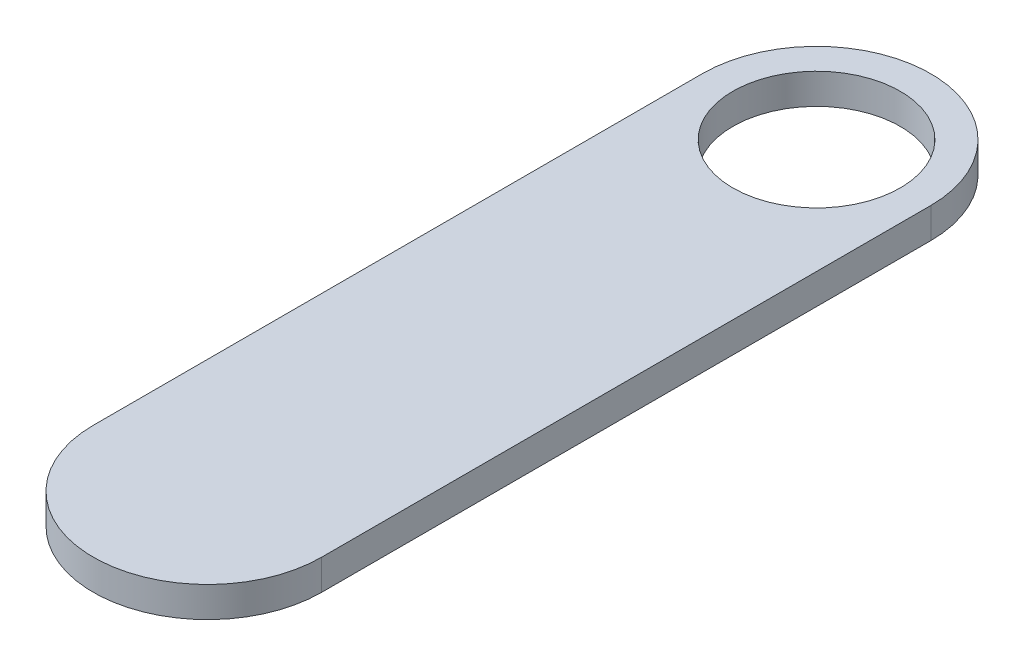
ISO-10303-21;
HEADER;
FILE_DESCRIPTION(('STEP AP214'),'2;1');
FILE_NAME('part.step','',(''),(''),'','','');
FILE_SCHEMA(('AUTOMOTIVE_DESIGN { 1 0 10303 214 1 1 1 1 }'));
ENDSEC;
DATA;
#1=APPLICATION_CONTEXT('core data for automotive mechanical design processes');
#2=APPLICATION_PROTOCOL_DEFINITION('international standard','automotive_design',2000,#1);
#3=PRODUCT_CONTEXT('',#1,'mechanical');
#4=PRODUCT('Part','Part','',(#3));
#5=PRODUCT_RELATED_PRODUCT_CATEGORY('part','',(#4));
#6=PRODUCT_DEFINITION_FORMATION('','',#4);
#7=PRODUCT_DEFINITION_CONTEXT('part definition',#1,'design');
#8=PRODUCT_DEFINITION('design','',#6,#7);
#9=PRODUCT_DEFINITION_SHAPE('','',#8);
#10=(LENGTH_UNIT() NAMED_UNIT(*) SI_UNIT(.MILLI.,.METRE.));
#11=(NAMED_UNIT(*) PLANE_ANGLE_UNIT() SI_UNIT($,.RADIAN.));
#12=(NAMED_UNIT(*) SI_UNIT($,.STERADIAN.) SOLID_ANGLE_UNIT());
#13=UNCERTAINTY_MEASURE_WITH_UNIT(LENGTH_MEASURE(1.E-05),#10,'distance_accuracy_value','');
#14=(GEOMETRIC_REPRESENTATION_CONTEXT(3) GLOBAL_UNCERTAINTY_ASSIGNED_CONTEXT((#13)) GLOBAL_UNIT_ASSIGNED_CONTEXT((#10,
#11,#12)) REPRESENTATION_CONTEXT('',''));
#15=CARTESIAN_POINT('',(0.,0.,0.));
#16=DIRECTION('',(0.,0.,1.));
#17=DIRECTION('',(1.,0.,0.));
#18=AXIS2_PLACEMENT_3D('',#15,#16,#17);
#19=CARTESIAN_POINT('',(0.,2.,0.));
#20=DIRECTION('',(0.,1.,0.));
#21=DIRECTION('',(0.,0.,1.));
#22=AXIS2_PLACEMENT_3D('',#19,#20,#21);
#23=PLANE('',#22);
#24=CARTESIAN_POINT('',(0.,2.,0.));
#25=DIRECTION('',(0.,1.,0.));
#26=DIRECTION('',(0.,0.,1.));
#27=AXIS2_PLACEMENT_3D('',#24,#25,#26);
#28=CIRCLE('',#27,7.5);
#29=CARTESIAN_POINT('',(-7.5,2.,0.));
#30=VERTEX_POINT('',#29);
#31=CARTESIAN_POINT('',(7.5,2.,0.));
#32=VERTEX_POINT('',#31);
#33=EDGE_CURVE('E91',#30,#32,#28,.T.);
#34=ORIENTED_EDGE('',*,*,#33,.T.);
#35=DIRECTION('',(0.,0.,-1.));
#36=VECTOR('',#35,1.);
#37=CARTESIAN_POINT('',(7.5,2.,0.));
#38=LINE('',#37,#36);
#39=CARTESIAN_POINT('',(7.5,2.,-40.));
#40=VERTEX_POINT('',#39);
#41=EDGE_CURVE('E86',#32,#40,#38,.T.);
#42=ORIENTED_EDGE('',*,*,#41,.T.);
#43=CARTESIAN_POINT('',(0.,2.,-40.));
#44=DIRECTION('',(0.,1.,0.));
#45=DIRECTION('',(0.,0.,1.));
#46=AXIS2_PLACEMENT_3D('',#43,#44,#45);
#47=CIRCLE('',#46,7.5);
#48=CARTESIAN_POINT('',(-7.5,2.,-40.));
#49=VERTEX_POINT('',#48);
#50=EDGE_CURVE('E89',#40,#49,#47,.T.);
#51=ORIENTED_EDGE('',*,*,#50,.T.);
#52=DIRECTION('',(0.,0.,1.));
#53=VECTOR('',#52,1.);
#54=CARTESIAN_POINT('',(-7.5,2.,0.));
#55=LINE('',#54,#53);
#56=EDGE_CURVE('E56',#49,#30,#55,.T.);
#57=ORIENTED_EDGE('',*,*,#56,.T.);
#58=EDGE_LOOP('',(#34,#42,#51,#57));
#59=FACE_BOUND('',#58,.T.);
#60=CARTESIAN_POINT('',(0.,2.,-40.));
#61=DIRECTION('',(0.,1.,0.));
#62=DIRECTION('',(0.,0.,1.));
#63=AXIS2_PLACEMENT_3D('',#60,#61,#62);
#64=CIRCLE('',#63,5.5);
#65=CARTESIAN_POINT('',(0.,2.,-34.5));
#66=VERTEX_POINT('',#65);
#67=EDGE_CURVE('E106',#66,#66,#64,.T.);
#68=ORIENTED_EDGE('',*,*,#67,.F.);
#69=EDGE_LOOP('',(#68));
#70=FACE_BOUND('',#69,.T.);
#71=ADVANCED_FACE('F39',(#59,#70),#23,.T.);
#72=CARTESIAN_POINT('',(0.,0.,0.));
#73=DIRECTION('',(0.,1.,0.));
#74=DIRECTION('',(0.,0.,1.));
#75=AXIS2_PLACEMENT_3D('',#72,#73,#74);
#76=PLANE('',#75);
#77=CARTESIAN_POINT('',(0.,0.,0.));
#78=DIRECTION('',(0.,1.,0.));
#79=DIRECTION('',(0.,0.,1.));
#80=AXIS2_PLACEMENT_3D('',#77,#78,#79);
#81=CIRCLE('',#80,7.5);
#82=CARTESIAN_POINT('',(-7.5,0.,0.));
#83=VERTEX_POINT('',#82);
#84=CARTESIAN_POINT('',(7.5,0.,0.));
#85=VERTEX_POINT('',#84);
#86=EDGE_CURVE('E103',#83,#85,#81,.T.);
#87=ORIENTED_EDGE('',*,*,#86,.F.);
#88=DIRECTION('',(0.,0.,1.));
#89=VECTOR('',#88,1.);
#90=CARTESIAN_POINT('',(-7.5,0.,0.));
#91=LINE('',#90,#89);
#92=CARTESIAN_POINT('',(-7.5,0.,-40.));
#93=VERTEX_POINT('',#92);
#94=EDGE_CURVE('E79',#93,#83,#91,.T.);
#95=ORIENTED_EDGE('',*,*,#94,.F.);
#96=CARTESIAN_POINT('',(0.,0.,-40.));
#97=DIRECTION('',(0.,1.,0.));
#98=DIRECTION('',(0.,0.,1.));
#99=AXIS2_PLACEMENT_3D('',#96,#97,#98);
#100=CIRCLE('',#99,7.5);
#101=CARTESIAN_POINT('',(7.5,0.,-40.));
#102=VERTEX_POINT('',#101);
#103=EDGE_CURVE('E73',#102,#93,#100,.T.);
#104=ORIENTED_EDGE('',*,*,#103,.F.);
#105=DIRECTION('',(0.,0.,-1.));
#106=VECTOR('',#105,1.);
#107=CARTESIAN_POINT('',(7.5,0.,0.));
#108=LINE('',#107,#106);
#109=EDGE_CURVE('E95',#85,#102,#108,.T.);
#110=ORIENTED_EDGE('',*,*,#109,.F.);
#111=EDGE_LOOP('',(#87,#95,#104,#110));
#112=FACE_BOUND('',#111,.T.);
#113=CARTESIAN_POINT('',(0.,0.,-40.));
#114=DIRECTION('',(0.,1.,0.));
#115=DIRECTION('',(0.,0.,1.));
#116=AXIS2_PLACEMENT_3D('',#113,#114,#115);
#117=CIRCLE('',#116,5.5);
#118=CARTESIAN_POINT('',(0.,0.,-34.5));
#119=VERTEX_POINT('',#118);
#120=EDGE_CURVE('E118',#119,#119,#117,.T.);
#121=ORIENTED_EDGE('',*,*,#120,.T.);
#122=EDGE_LOOP('',(#121));
#123=FACE_BOUND('',#122,.T.);
#124=ADVANCED_FACE('F114',(#112,#123),#76,.F.);
#125=CARTESIAN_POINT('',(0.,2.,0.));
#126=DIRECTION('',(0.,-1.,0.));
#127=DIRECTION('',(0.,0.,-1.));
#128=AXIS2_PLACEMENT_3D('',#125,#126,#127);
#129=CYLINDRICAL_SURFACE('',#128,7.5);
#130=ORIENTED_EDGE('',*,*,#86,.T.);
#131=DIRECTION('',(0.,-1.,0.));
#132=VECTOR('',#131,1.);
#133=CARTESIAN_POINT('',(7.5,2.,0.));
#134=LINE('',#133,#132);
#135=EDGE_CURVE('E11',#32,#85,#134,.T.);
#136=ORIENTED_EDGE('',*,*,#135,.F.);
#137=ORIENTED_EDGE('',*,*,#33,.F.);
#138=DIRECTION('',(0.,-1.,0.));
#139=VECTOR('',#138,1.);
#140=CARTESIAN_POINT('',(-7.5,2.,0.));
#141=LINE('',#140,#139);
#142=EDGE_CURVE('E99',#30,#83,#141,.T.);
#143=ORIENTED_EDGE('',*,*,#142,.T.);
#144=EDGE_LOOP('',(#130,#136,#137,#143));
#145=FACE_BOUND('',#144,.T.);
#146=ADVANCED_FACE('F41',(#145),#129,.T.);
#147=CARTESIAN_POINT('',(7.5,2.,0.));
#148=DIRECTION('',(-1.,0.,0.));
#149=DIRECTION('',(0.,0.,1.));
#150=AXIS2_PLACEMENT_3D('',#147,#148,#149);
#151=PLANE('',#150);
#152=ORIENTED_EDGE('',*,*,#109,.T.);
#153=DIRECTION('',(0.,-1.,0.));
#154=VECTOR('',#153,1.);
#155=CARTESIAN_POINT('',(7.5,2.,-40.));
#156=LINE('',#155,#154);
#157=EDGE_CURVE('E48',#40,#102,#156,.T.);
#158=ORIENTED_EDGE('',*,*,#157,.F.);
#159=ORIENTED_EDGE('',*,*,#41,.F.);
#160=ORIENTED_EDGE('',*,*,#135,.T.);
#161=EDGE_LOOP('',(#152,#158,#159,#160));
#162=FACE_BOUND('',#161,.T.);
#163=ADVANCED_FACE('F94',(#162),#151,.F.);
#164=CARTESIAN_POINT('',(0.,2.,-40.));
#165=DIRECTION('',(0.,-1.,0.));
#166=DIRECTION('',(0.,0.,-1.));
#167=AXIS2_PLACEMENT_3D('',#164,#165,#166);
#168=CYLINDRICAL_SURFACE('',#167,7.5);
#169=ORIENTED_EDGE('',*,*,#103,.T.);
#170=DIRECTION('',(0.,-1.,0.));
#171=VECTOR('',#170,1.);
#172=CARTESIAN_POINT('',(-7.5,2.,-40.));
#173=LINE('',#172,#171);
#174=EDGE_CURVE('E96',#49,#93,#173,.T.);
#175=ORIENTED_EDGE('',*,*,#174,.F.);
#176=ORIENTED_EDGE('',*,*,#50,.F.);
#177=ORIENTED_EDGE('',*,*,#157,.T.);
#178=EDGE_LOOP('',(#169,#175,#176,#177));
#179=FACE_BOUND('',#178,.T.);
#180=ADVANCED_FACE('F97',(#179),#168,.T.);
#181=CARTESIAN_POINT('',(-7.5,2.,0.));
#182=DIRECTION('',(1.,0.,0.));
#183=DIRECTION('',(0.,0.,-1.));
#184=AXIS2_PLACEMENT_3D('',#181,#182,#183);
#185=PLANE('',#184);
#186=ORIENTED_EDGE('',*,*,#94,.T.);
#187=ORIENTED_EDGE('',*,*,#142,.F.);
#188=ORIENTED_EDGE('',*,*,#56,.F.);
#189=ORIENTED_EDGE('',*,*,#174,.T.);
#190=EDGE_LOOP('',(#186,#187,#188,#189));
#191=FACE_BOUND('',#190,.T.);
#192=ADVANCED_FACE('F111',(#191),#185,.F.);
#193=CARTESIAN_POINT('',(0.,2.,-40.));
#194=DIRECTION('',(0.,-1.,0.));
#195=DIRECTION('',(0.,0.,-1.));
#196=AXIS2_PLACEMENT_3D('',#193,#194,#195);
#197=CYLINDRICAL_SURFACE('',#196,5.5);
#198=ORIENTED_EDGE('',*,*,#67,.T.);
#199=EDGE_LOOP('',(#198));
#200=FACE_BOUND('',#199,.T.);
#201=ORIENTED_EDGE('',*,*,#120,.F.);
#202=EDGE_LOOP('',(#201));
#203=FACE_BOUND('',#202,.T.);
#204=ADVANCED_FACE('F124',(#200,#203),#197,.F.);
#205=CLOSED_SHELL('',(#71,#124,#146,#163,#180,#192,#204));
#206=MANIFOLD_SOLID_BREP('B2',#205);
#207=ADVANCED_BREP_SHAPE_REPRESENTATION('',(#18,#206),#14);
#208=SHAPE_DEFINITION_REPRESENTATION(#9,#207);
ENDSEC;
END-ISO-10303-21;
